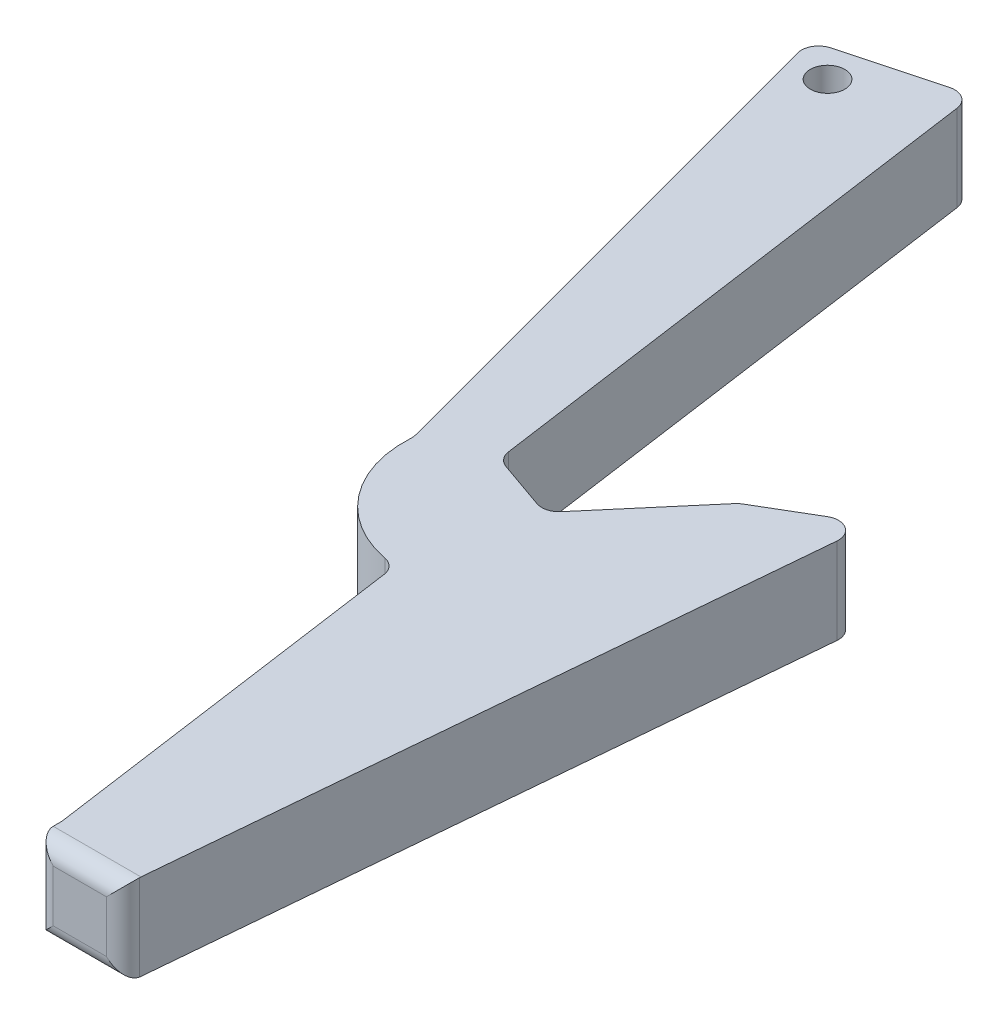
ISO-10303-21;
HEADER;
FILE_DESCRIPTION(('STEP AP214'),'2;1');
FILE_NAME('part.step','',(''),(''),'','','');
FILE_SCHEMA(('AUTOMOTIVE_DESIGN { 1 0 10303 214 1 1 1 1 }'));
ENDSEC;
DATA;
#1=APPLICATION_CONTEXT('core data for automotive mechanical design processes');
#2=APPLICATION_PROTOCOL_DEFINITION('international standard','automotive_design',2000,#1);
#3=PRODUCT_CONTEXT('',#1,'mechanical');
#4=PRODUCT('Part','Part','',(#3));
#5=PRODUCT_RELATED_PRODUCT_CATEGORY('part','',(#4));
#6=PRODUCT_DEFINITION_FORMATION('','',#4);
#7=PRODUCT_DEFINITION_CONTEXT('part definition',#1,'design');
#8=PRODUCT_DEFINITION('design','',#6,#7);
#9=PRODUCT_DEFINITION_SHAPE('','',#8);
#10=(LENGTH_UNIT() NAMED_UNIT(*) SI_UNIT(.MILLI.,.METRE.));
#11=(NAMED_UNIT(*) PLANE_ANGLE_UNIT() SI_UNIT($,.RADIAN.));
#12=(NAMED_UNIT(*) SI_UNIT($,.STERADIAN.) SOLID_ANGLE_UNIT());
#13=UNCERTAINTY_MEASURE_WITH_UNIT(LENGTH_MEASURE(1.E-05),#10,'distance_accuracy_value','');
#14=(GEOMETRIC_REPRESENTATION_CONTEXT(3) GLOBAL_UNCERTAINTY_ASSIGNED_CONTEXT((#13)) GLOBAL_UNIT_ASSIGNED_CONTEXT((#10,
#11,#12)) REPRESENTATION_CONTEXT('',''));
#15=CARTESIAN_POINT('',(0.,0.,0.));
#16=DIRECTION('',(0.,0.,1.));
#17=DIRECTION('',(1.,0.,0.));
#18=AXIS2_PLACEMENT_3D('',#15,#16,#17);
#19=CARTESIAN_POINT('',(-392.834631007093,131.993581300035,-1660.57349387515));
#20=DIRECTION('',(-0.990268068741571,0.,0.139173100960062));
#21=DIRECTION('',(0.139173100960062,0.,0.990268068741571));
#22=AXIS2_PLACEMENT_3D('',#19,#20,#21);
#23=PLANE('',#22);
#24=DIRECTION('',(-0.139173100960062,0.,-0.990268068741571));
#25=VECTOR('',#24,1.);
#26=CARTESIAN_POINT('',(-392.834631007093,131.993581300035,-1660.57349387515));
#27=LINE('',#26,#25);
#28=CARTESIAN_POINT('',(-168.687755361147,131.993581300035,-65.6856015369362));
#29=VERTEX_POINT('',#28);
#30=CARTESIAN_POINT('',(-384.843840888038,131.993581300035,-1603.7160678041));
#31=VERTEX_POINT('',#30);
#32=EDGE_CURVE('E267',#29,#31,#27,.T.);
#33=ORIENTED_EDGE('',*,*,#32,.F.);
#34=DIRECTION('',(0.,-1.,0.));
#35=VECTOR('',#34,1.);
#36=CARTESIAN_POINT('',(-168.687755361147,-121.994217107965,-65.6856015369366));
#37=LINE('',#36,#35);
#38=CARTESIAN_POINT('',(-168.687755361147,-121.994217107965,-65.6856015369362));
#39=VERTEX_POINT('',#38);
#40=EDGE_CURVE('E333',#29,#39,#37,.T.);
#41=ORIENTED_EDGE('',*,*,#40,.T.);
#42=DIRECTION('',(-0.139173100960062,0.,-0.990268068741571));
#43=VECTOR('',#42,1.);
#44=CARTESIAN_POINT('',(-392.834631007093,-121.994217107965,-1660.57349387515));
#45=LINE('',#44,#43);
#46=CARTESIAN_POINT('',(-384.843840888038,-121.994217107965,-1603.7160678041));
#47=VERTEX_POINT('',#46);
#48=EDGE_CURVE('E241',#39,#47,#45,.T.);
#49=ORIENTED_EDGE('',*,*,#48,.T.);
#50=DIRECTION('',(0.,-1.,0.));
#51=VECTOR('',#50,1.);
#52=CARTESIAN_POINT('',(-384.843840888038,131.993581300035,-1603.7160678041));
#53=LINE('',#52,#51);
#54=EDGE_CURVE('E331',#47,#31,#53,.F.);
#55=ORIENTED_EDGE('',*,*,#54,.T.);
#56=EDGE_LOOP('',(#33,#41,#49,#55));
#57=FACE_BOUND('',#56,.T.);
#58=ADVANCED_FACE('F47',(#57),#23,.F.);
#59=CARTESIAN_POINT('',(-392.834631007093,131.993581300035,-1660.57349387515));
#60=DIRECTION('',(0.258819045102515,0.,0.96592582628907));
#61=DIRECTION('',(0.96592582628907,0.,-0.258819045102515));
#62=AXIS2_PLACEMENT_3D('',#59,#60,#61);
#63=PLANE('',#62);
#64=DIRECTION('',(-0.96592582628907,0.,0.258819045102515));
#65=VECTOR('',#64,1.);
#66=CARTESIAN_POINT('',(-392.834631007093,-121.994217107965,-1660.57349387515));
#67=LINE('',#66,#65);
#68=CARTESIAN_POINT('',(-448.294418101051,-121.994217107965,-1645.71308871093));
#69=VERTEX_POINT('',#68);
#70=CARTESIAN_POINT('',(-724.749653810176,-121.994217107965,-1571.63713155931));
#71=VERTEX_POINT('',#70);
#72=EDGE_CURVE('E244',#69,#71,#67,.T.);
#73=ORIENTED_EDGE('',*,*,#72,.T.);
#74=DIRECTION('',(0.,-1.,0.));
#75=VECTOR('',#74,1.);
#76=CARTESIAN_POINT('',(-724.749653810175,131.993581300035,-1571.63713155931));
#77=LINE('',#76,#75);
#78=CARTESIAN_POINT('',(-724.749653810176,131.993581300035,-1571.63713155931));
#79=VERTEX_POINT('',#78);
#80=EDGE_CURVE('E338',#71,#79,#77,.F.);
#81=ORIENTED_EDGE('',*,*,#80,.T.);
#82=DIRECTION('',(-0.96592582628907,0.,0.258819045102515));
#83=VECTOR('',#82,1.);
#84=CARTESIAN_POINT('',(-392.834631007093,131.993581300035,-1660.57349387515));
#85=LINE('',#84,#83);
#86=CARTESIAN_POINT('',(-448.294418101051,131.993581300035,-1645.71308871093));
#87=VERTEX_POINT('',#86);
#88=EDGE_CURVE('E376',#87,#79,#85,.T.);
#89=ORIENTED_EDGE('',*,*,#88,.F.);
#90=DIRECTION('',(0.,-1.,0.));
#91=VECTOR('',#90,1.);
#92=CARTESIAN_POINT('',(-448.294418101051,131.993581300035,-1645.71308871093));
#93=LINE('',#92,#91);
#94=EDGE_CURVE('E336',#87,#69,#93,.T.);
#95=ORIENTED_EDGE('',*,*,#94,.T.);
#96=EDGE_LOOP('',(#73,#81,#89,#95));
#97=FACE_BOUND('',#96,.T.);
#98=ADVANCED_FACE('F446',(#97),#63,.F.);
#99=CARTESIAN_POINT('',(-773.816328619093,131.993581300035,-1558.48975566898));
#100=DIRECTION('',(0.965925826289069,0.,-0.258819045102518));
#101=DIRECTION('',(-0.258819045102518,0.,-0.965925826289069));
#102=AXIS2_PLACEMENT_3D('',#99,#100,#101);
#103=PLANE('',#102);
#104=DIRECTION('',(0.258819045102518,0.,0.965925826289069));
#105=VECTOR('',#104,1.);
#106=CARTESIAN_POINT('',(-773.816328619093,-121.994217107965,-1558.48975566898));
#107=LINE('',#106,#105);
#108=CARTESIAN_POINT('',(-760.668952728763,-121.994217107965,-1509.42308086007));
#109=VERTEX_POINT('',#108);
#110=CARTESIAN_POINT('',(-348.726244773765,-121.994217107965,27.9680350355127));
#111=VERTEX_POINT('',#110);
#112=EDGE_CURVE('E247',#109,#111,#107,.T.);
#113=ORIENTED_EDGE('',*,*,#112,.T.);
#114=DIRECTION('',(0.,1.,0.));
#115=VECTOR('',#114,1.);
#116=CARTESIAN_POINT('',(-348.726244773765,131.993581300035,27.9680350355134));
#117=LINE('',#116,#115);
#118=CARTESIAN_POINT('',(-348.726244773765,131.993581300035,27.9680350355127));
#119=VERTEX_POINT('',#118);
#120=EDGE_CURVE('E312',#111,#119,#117,.T.);
#121=ORIENTED_EDGE('',*,*,#120,.T.);
#122=DIRECTION('',(0.258819045102518,0.,0.965925826289069));
#123=VECTOR('',#122,1.);
#124=CARTESIAN_POINT('',(-773.816328619093,131.993581300035,-1558.48975566898));
#125=LINE('',#124,#123);
#126=CARTESIAN_POINT('',(-760.668952728763,131.993581300035,-1509.42308086007));
#127=VERTEX_POINT('',#126);
#128=EDGE_CURVE('E379',#127,#119,#125,.T.);
#129=ORIENTED_EDGE('',*,*,#128,.F.);
#130=DIRECTION('',(0.,-1.,0.));
#131=VECTOR('',#130,1.);
#132=CARTESIAN_POINT('',(-760.668952728763,131.993581300035,-1509.42308086007));
#133=LINE('',#132,#131);
#134=EDGE_CURVE('E309',#127,#109,#133,.T.);
#135=ORIENTED_EDGE('',*,*,#134,.T.);
#136=EDGE_LOOP('',(#113,#121,#129,#135));
#137=FACE_BOUND('',#136,.T.);
#138=ADVANCED_FACE('F453',(#137),#103,.F.);
#139=CARTESIAN_POINT('',(-17.4560289970844,131.993581300035,63.2717548255097));
#140=DIRECTION('',(0.,-1.,0.));
#141=DIRECTION('',(0.,0.,-1.));
#142=AXIS2_PLACEMENT_3D('',#139,#140,#141);
#143=CYLINDRICAL_SURFACE('',#142,330.1841379304);
#144=CARTESIAN_POINT('',(-17.4560289970844,131.993581300035,63.2717548255097));
#145=DIRECTION('',(0.,1.,0.));
#146=DIRECTION('',(0.,0.,1.));
#147=AXIS2_PLACEMENT_3D('',#144,#145,#146);
#148=CIRCLE('',#147,330.1841379304);
#149=CARTESIAN_POINT('',(-347.081334171269,131.993581300035,44.0695901124656));
#150=VERTEX_POINT('',#149);
#151=CARTESIAN_POINT('',(-79.9099953869851,131.993581300035,387.495546400111));
#152=VERTEX_POINT('',#151);
#153=EDGE_CURVE('E210',#150,#152,#148,.T.);
#154=ORIENTED_EDGE('',*,*,#153,.F.);
#155=DIRECTION('',(0.,-1.,0.));
#156=VECTOR('',#155,1.);
#157=CARTESIAN_POINT('',(-347.081334171269,131.993581300035,44.0695901124656));
#158=LINE('',#157,#156);
#159=CARTESIAN_POINT('',(-347.081334171269,-121.994217107965,44.0695901124656));
#160=VERTEX_POINT('',#159);
#161=EDGE_CURVE('E306',#150,#160,#158,.T.);
#162=ORIENTED_EDGE('',*,*,#161,.T.);
#163=CARTESIAN_POINT('',(-17.4560289970844,-121.994217107965,63.2717548255097));
#164=DIRECTION('',(0.,1.,0.));
#165=DIRECTION('',(0.,0.,1.));
#166=AXIS2_PLACEMENT_3D('',#163,#164,#165);
#167=CIRCLE('',#166,330.1841379304);
#168=CARTESIAN_POINT('',(-79.9099953869851,-121.994217107965,387.495546400111));
#169=VERTEX_POINT('',#168);
#170=EDGE_CURVE('E250',#160,#169,#167,.T.);
#171=ORIENTED_EDGE('',*,*,#170,.T.);
#172=DIRECTION('',(0.,-1.,0.));
#173=VECTOR('',#172,1.);
#174=CARTESIAN_POINT('',(-79.9099953869851,131.993581300035,387.495546400111));
#175=LINE('',#174,#173);
#176=EDGE_CURVE('E304',#169,#152,#175,.F.);
#177=ORIENTED_EDGE('',*,*,#176,.T.);
#178=EDGE_LOOP('',(#154,#162,#171,#177));
#179=FACE_BOUND('',#178,.T.);
#180=ADVANCED_FACE('F457',(#179),#143,.T.);
#181=CARTESIAN_POINT('',(116.079849164418,131.993581300035,1535.2874308478));
#182=DIRECTION('',(0.990268068741571,0.,-0.139173100960063));
#183=DIRECTION('',(-0.139173100960063,0.,-0.990268068741571));
#184=AXIS2_PLACEMENT_3D('',#181,#182,#183);
#185=PLANE('',#184);
#186=DIRECTION('',(0.139173100960063,0.,0.990268068741571));
#187=VECTOR('',#186,1.);
#188=CARTESIAN_POINT('',(116.079849164418,131.993581300035,1535.2874308478));
#189=LINE('',#188,#187);
#190=CARTESIAN_POINT('',(-39.2150965858257,131.993581300035,430.306475817188));
#191=VERTEX_POINT('',#190);
#192=CARTESIAN_POINT('',(116.079849164418,131.993581300035,1535.2874308478));
#193=VERTEX_POINT('',#192);
#194=EDGE_CURVE('E199',#191,#193,#189,.T.);
#195=ORIENTED_EDGE('',*,*,#194,.F.);
#196=DIRECTION('',(0.,1.,0.));
#197=VECTOR('',#196,1.);
#198=CARTESIAN_POINT('',(-39.2150965858257,-121.994217107965,430.306475817188));
#199=LINE('',#198,#197);
#200=CARTESIAN_POINT('',(-39.2150965858257,-121.994217107965,430.306475817188));
#201=VERTEX_POINT('',#200);
#202=EDGE_CURVE('E314',#191,#201,#199,.F.);
#203=ORIENTED_EDGE('',*,*,#202,.T.);
#204=DIRECTION('',(0.139173100960063,0.,0.990268068741571));
#205=VECTOR('',#204,1.);
#206=CARTESIAN_POINT('',(116.079849164418,-121.994217107965,1535.2874308478));
#207=LINE('',#206,#205);
#208=CARTESIAN_POINT('',(116.079849164418,-121.994217107965,1535.2874308478));
#209=VERTEX_POINT('',#208);
#210=EDGE_CURVE('E216',#201,#209,#207,.T.);
#211=ORIENTED_EDGE('',*,*,#210,.T.);
#212=DIRECTION('',(0.,-1.,0.));
#213=VECTOR('',#212,1.);
#214=CARTESIAN_POINT('',(116.079849164418,131.993581300035,1535.2874308478));
#215=LINE('',#214,#213);
#216=EDGE_CURVE('E213',#193,#209,#215,.T.);
#217=ORIENTED_EDGE('',*,*,#216,.F.);
#218=EDGE_LOOP('',(#195,#203,#211,#217));
#219=FACE_BOUND('',#218,.T.);
#220=ADVANCED_FACE('F214',(#219),#185,.F.);
#221=CARTESIAN_POINT('',(116.079849164418,131.993581300035,1611.4837703702));
#222=DIRECTION('',(1.,0.,0.));
#223=DIRECTION('',(0.,0.,-1.));
#224=AXIS2_PLACEMENT_3D('',#221,#222,#223);
#225=PLANE('',#224);
#226=DIRECTION('',(0.,0.,1.));
#227=VECTOR('',#226,1.);
#228=CARTESIAN_POINT('',(116.079849164418,-121.994217107965,1611.4837703702));
#229=LINE('',#228,#227);
#230=CARTESIAN_POINT('',(116.079849164418,-121.994217107965,1560.6862106886));
#231=VERTEX_POINT('',#230);
#232=EDGE_CURVE('E254',#209,#231,#229,.T.);
#233=ORIENTED_EDGE('',*,*,#232,.T.);
#234=DIRECTION('',(0.,-1.,0.));
#235=VECTOR('',#234,1.);
#236=CARTESIAN_POINT('',(116.079849164418,131.993581300035,1560.6862106886));
#237=LINE('',#236,#235);
#238=CARTESIAN_POINT('',(116.079849164418,131.993581300035,1560.6862106886));
#239=VERTEX_POINT('',#238);
#240=EDGE_CURVE('E226',#231,#239,#237,.F.);
#241=ORIENTED_EDGE('',*,*,#240,.T.);
#242=DIRECTION('',(0.,0.,1.));
#243=VECTOR('',#242,1.);
#244=CARTESIAN_POINT('',(116.079849164418,131.993581300035,1611.4837703702));
#245=LINE('',#244,#243);
#246=EDGE_CURVE('E203',#193,#239,#245,.T.);
#247=ORIENTED_EDGE('',*,*,#246,.F.);
#248=ORIENTED_EDGE('',*,*,#216,.T.);
#249=EDGE_LOOP('',(#233,#241,#247,#248));
#250=FACE_BOUND('',#249,.T.);
#251=ADVANCED_FACE('F224',(#250),#225,.F.);
#252=CARTESIAN_POINT('',(370.067647572418,131.993581300035,1611.4837703702));
#253=DIRECTION('',(0.,0.,-1.));
#254=DIRECTION('',(-1.,0.,0.));
#255=AXIS2_PLACEMENT_3D('',#252,#253,#254);
#256=PLANE('',#255);
#257=DIRECTION('',(1.,0.,0.));
#258=VECTOR('',#257,1.);
#259=CARTESIAN_POINT('',(116.079849164418,81.1960216184347,1611.4837703702));
#260=LINE('',#259,#258);
#261=CARTESIAN_POINT('',(323.606120491679,81.1960216184347,1611.4837703702));
#262=VERTEX_POINT('',#261);
#263=CARTESIAN_POINT('',(166.877408846018,81.1960216184347,1611.4837703702));
#264=VERTEX_POINT('',#263);
#265=EDGE_CURVE('E272',#262,#264,#260,.F.);
#266=ORIENTED_EDGE('',*,*,#265,.T.);
#267=DIRECTION('',(0.,-1.,0.));
#268=VECTOR('',#267,1.);
#269=CARTESIAN_POINT('',(166.877408846018,131.993581300035,1611.4837703702));
#270=LINE('',#269,#268);
#271=CARTESIAN_POINT('',(166.877408846018,-71.1966574263653,1611.4837703702));
#272=VERTEX_POINT('',#271);
#273=EDGE_CURVE('E274',#264,#272,#270,.T.);
#274=ORIENTED_EDGE('',*,*,#273,.T.);
#275=DIRECTION('',(1.,0.,0.));
#276=VECTOR('',#275,1.);
#277=CARTESIAN_POINT('',(370.067647572418,-71.1966574263653,1611.4837703702));
#278=LINE('',#277,#276);
#279=CARTESIAN_POINT('',(323.606120491679,-71.1966574263653,1611.4837703702));
#280=VERTEX_POINT('',#279);
#281=EDGE_CURVE('E220',#272,#280,#278,.T.);
#282=ORIENTED_EDGE('',*,*,#281,.T.);
#283=DIRECTION('',(0.,-1.,0.));
#284=VECTOR('',#283,1.);
#285=CARTESIAN_POINT('',(323.606120491679,131.993581300035,1611.4837703702));
#286=LINE('',#285,#284);
#287=EDGE_CURVE('E270',#280,#262,#286,.F.);
#288=ORIENTED_EDGE('',*,*,#287,.T.);
#289=EDGE_LOOP('',(#266,#274,#282,#288));
#290=FACE_BOUND('',#289,.T.);
#291=ADVANCED_FACE('F401',(#290),#256,.F.);
#292=CARTESIAN_POINT('',(551.60217621528,131.993581300035,-420.418616893803));
#293=DIRECTION('',(-0.996032724501308,0.,-0.0889877054569934));
#294=DIRECTION('',(-0.0889877054569934,0.,0.996032724501308));
#295=AXIS2_PLACEMENT_3D('',#292,#293,#294);
#296=PLANE('',#295);
#297=DIRECTION('',(0.0889877054569934,0.,-0.996032724501308));
#298=VECTOR('',#297,1.);
#299=CARTESIAN_POINT('',(551.60217621528,131.993581300035,-420.418616893803));
#300=LINE('',#299,#298);
#301=CARTESIAN_POINT('',(374.60601078849,131.993581300035,1560.6862106886));
#302=VERTEX_POINT('',#301);
#303=CARTESIAN_POINT('',(542.803771441458,131.993581300035,-321.938731013718));
#304=VERTEX_POINT('',#303);
#305=EDGE_CURVE('E227',#302,#304,#300,.T.);
#306=ORIENTED_EDGE('',*,*,#305,.F.);
#307=CARTESIAN_POINT('',(374.60601078849,81.1960216184347,1560.6862106886));
#308=DIRECTION('',(-0.996032724501308,0.,-0.0889877054569934));
#309=DIRECTION('',(-0.0889877054569934,0.,0.996032724501308));
#310=AXIS2_PLACEMENT_3D('',#307,#308,#309);
#311=ELLIPSE('',#310,50.9998902968105,50.7975596816);
#312=CARTESIAN_POINT('',(374.202152259361,131.792053386117,1565.20656896748));
#313=VERTEX_POINT('',#312);
#314=EDGE_CURVE('E294',#302,#313,#311,.F.);
#315=ORIENTED_EDGE('',*,*,#314,.T.);
#316=DIRECTION('',(0.,-1.,0.));
#317=VECTOR('',#316,1.);
#318=CARTESIAN_POINT('',(374.202152259361,131.993581300035,1565.20656896748));
#319=LINE('',#318,#317);
#320=CARTESIAN_POINT('',(374.202152259361,-121.792689194047,1565.20656896748));
#321=VERTEX_POINT('',#320);
#322=EDGE_CURVE('E292',#313,#321,#319,.T.);
#323=ORIENTED_EDGE('',*,*,#322,.T.);
#324=CARTESIAN_POINT('',(374.60601078849,-71.1966574263653,1560.6862106886));
#325=DIRECTION('',(-0.996032724501308,0.,-0.0889877054569934));
#326=DIRECTION('',(0.0889877054569934,0.,-0.996032724501308));
#327=AXIS2_PLACEMENT_3D('',#324,#325,#326);
#328=ELLIPSE('',#327,50.9998902968105,50.7975596816);
#329=CARTESIAN_POINT('',(374.60601078849,-121.994217107965,1560.6862106886));
#330=VERTEX_POINT('',#329);
#331=EDGE_CURVE('E290',#321,#330,#328,.F.);
#332=ORIENTED_EDGE('',*,*,#331,.T.);
#333=DIRECTION('',(0.0889877054569934,0.,-0.996032724501308));
#334=VECTOR('',#333,1.);
#335=CARTESIAN_POINT('',(551.60217621528,-121.994217107965,-420.418616893803));
#336=LINE('',#335,#334);
#337=CARTESIAN_POINT('',(542.803771441458,-121.994217107965,-321.938731013718));
#338=VERTEX_POINT('',#337);
#339=EDGE_CURVE('E256',#330,#338,#336,.T.);
#340=ORIENTED_EDGE('',*,*,#339,.T.);
#341=DIRECTION('',(0.,-1.,0.));
#342=VECTOR('',#341,1.);
#343=CARTESIAN_POINT('',(542.803771441458,131.993581300035,-321.938731013718));
#344=LINE('',#343,#342);
#345=EDGE_CURVE('E288',#338,#304,#344,.F.);
#346=ORIENTED_EDGE('',*,*,#345,.T.);
#347=EDGE_LOOP('',(#306,#315,#323,#332,#340,#346));
#348=FACE_BOUND('',#347,.T.);
#349=ADVANCED_FACE('F406',(#348),#296,.F.);
#350=CARTESIAN_POINT('',(302.084426621297,131.993581300035,-273.387870161801));
#351=DIRECTION('',(0.507675652585662,0.,0.861548275937989));
#352=DIRECTION('',(0.861548275937989,0.,-0.507675652585662));
#353=AXIS2_PLACEMENT_3D('',#350,#351,#352);
#354=PLANE('',#353);
#355=DIRECTION('',(-0.861548275937989,0.,0.507675652585662));
#356=VECTOR('',#355,1.);
#357=CARTESIAN_POINT('',(302.084426621297,131.993581300035,-273.387870161801));
#358=LINE('',#357,#356);
#359=CARTESIAN_POINT('',(466.419055412661,131.993581300035,-370.223639258138));
#360=VERTEX_POINT('',#359);
#361=CARTESIAN_POINT('',(309.451536343491,131.993581300035,-277.729010803993));
#362=VERTEX_POINT('',#361);
#363=EDGE_CURVE('E230',#360,#362,#358,.T.);
#364=ORIENTED_EDGE('',*,*,#363,.F.);
#365=DIRECTION('',(0.,-1.,0.));
#366=VECTOR('',#365,1.);
#367=CARTESIAN_POINT('',(466.419055412661,131.993581300035,-370.223639258138));
#368=LINE('',#367,#366);
#369=CARTESIAN_POINT('',(466.419055412661,-121.994217107965,-370.223639258138));
#370=VERTEX_POINT('',#369);
#371=EDGE_CURVE('E318',#360,#370,#368,.T.);
#372=ORIENTED_EDGE('',*,*,#371,.T.);
#373=DIRECTION('',(-0.861548275937989,0.,0.507675652585662));
#374=VECTOR('',#373,1.);
#375=CARTESIAN_POINT('',(302.084426621297,-121.994217107965,-273.387870161801));
#376=LINE('',#375,#374);
#377=CARTESIAN_POINT('',(309.451536343491,-121.994217107965,-277.729010803993));
#378=VERTEX_POINT('',#377);
#379=EDGE_CURVE('E259',#370,#378,#376,.T.);
#380=ORIENTED_EDGE('',*,*,#379,.T.);
#381=DIRECTION('',(0.,-1.,0.));
#382=VECTOR('',#381,1.);
#383=CARTESIAN_POINT('',(309.451536343491,131.993581300035,-277.729010803993));
#384=LINE('',#383,#382);
#385=EDGE_CURVE('E316',#378,#362,#384,.F.);
#386=ORIENTED_EDGE('',*,*,#385,.T.);
#387=EDGE_LOOP('',(#364,#372,#380,#386));
#388=FACE_BOUND('',#387,.T.);
#389=ADVANCED_FACE('F415',(#388),#354,.F.);
#390=CARTESIAN_POINT('',(38.8078137511931,131.993581300035,36.1771756208437));
#391=DIRECTION('',(0.761761607553109,0.,0.647857432818443));
#392=DIRECTION('',(0.647857432818443,0.,-0.761761607553109));
#393=AXIS2_PLACEMENT_3D('',#390,#391,#392);
#394=PLANE('',#393);
#395=DIRECTION('',(-0.647857432818443,0.,0.761761607553109));
#396=VECTOR('',#395,1.);
#397=CARTESIAN_POINT('',(38.8078137511931,131.993581300035,36.1771756208437));
#398=LINE('',#397,#396);
#399=CARTESIAN_POINT('',(296.544589881776,131.993581300035,-266.874037447217));
#400=VERTEX_POINT('',#399);
#401=CARTESIAN_POINT('',(61.3997177416087,131.993581300035,9.61323696761944));
#402=VERTEX_POINT('',#401);
#403=EDGE_CURVE('E236',#400,#402,#398,.T.);
#404=ORIENTED_EDGE('',*,*,#403,.F.);
#405=DIRECTION('',(0.,-1.,0.));
#406=VECTOR('',#405,1.);
#407=CARTESIAN_POINT('',(296.544589881776,131.993581300035,-266.874037447216));
#408=LINE('',#407,#406);
#409=CARTESIAN_POINT('',(296.544589881776,-121.994217107965,-266.874037447217));
#410=VERTEX_POINT('',#409);
#411=EDGE_CURVE('E323',#400,#410,#408,.T.);
#412=ORIENTED_EDGE('',*,*,#411,.T.);
#413=DIRECTION('',(-0.647857432818443,0.,0.761761607553109));
#414=VECTOR('',#413,1.);
#415=CARTESIAN_POINT('',(38.8078137511931,-121.994217107965,36.1771756208437));
#416=LINE('',#415,#414);
#417=CARTESIAN_POINT('',(61.3997177416087,-121.994217107965,9.61323696761944));
#418=VERTEX_POINT('',#417);
#419=EDGE_CURVE('E262',#410,#418,#416,.T.);
#420=ORIENTED_EDGE('',*,*,#419,.T.);
#421=DIRECTION('',(0.,-1.,0.));
#422=VECTOR('',#421,1.);
#423=CARTESIAN_POINT('',(61.3997177416087,131.993581300035,9.61323696761944));
#424=LINE('',#423,#422);
#425=EDGE_CURVE('E321',#418,#402,#424,.F.);
#426=ORIENTED_EDGE('',*,*,#425,.T.);
#427=EDGE_LOOP('',(#404,#412,#420,#426));
#428=FACE_BOUND('',#427,.T.);
#429=ADVANCED_FACE('F424',(#428),#394,.F.);
#430=CARTESIAN_POINT('',(-164.382424975207,131.993581300035,-35.0515840639549));
#431=DIRECTION('',(-0.330814518681776,0.,0.943695795386069));
#432=DIRECTION('',(0.943695795386069,0.,0.330814518681776));
#433=AXIS2_PLACEMENT_3D('',#430,#431,#432);
#434=PLANE('',#433);
#435=DIRECTION('',(-0.943695795386069,0.,-0.330814518681776));
#436=VECTOR('',#435,1.);
#437=CARTESIAN_POINT('',(-164.382424975207,131.993581300035,-35.0515840639549));
#438=LINE('',#437,#436);
#439=CARTESIAN_POINT('',(5.89951676250088,131.993581300035,24.641103846255));
#440=VERTEX_POINT('',#439);
#441=CARTESIAN_POINT('',(-135.189124294742,131.993581300035,-24.8178119516298));
#442=VERTEX_POINT('',#441);
#443=EDGE_CURVE('E221',#440,#442,#438,.T.);
#444=ORIENTED_EDGE('',*,*,#443,.F.);
#445=DIRECTION('',(0.,-1.,0.));
#446=VECTOR('',#445,1.);
#447=CARTESIAN_POINT('',(5.89951676250088,-121.994217107965,24.641103846255));
#448=LINE('',#447,#446);
#449=CARTESIAN_POINT('',(5.89951676250088,-121.994217107965,24.641103846255));
#450=VERTEX_POINT('',#449);
#451=EDGE_CURVE('E328',#440,#450,#448,.T.);
#452=ORIENTED_EDGE('',*,*,#451,.T.);
#453=DIRECTION('',(-0.943695795386069,0.,-0.330814518681776));
#454=VECTOR('',#453,1.);
#455=CARTESIAN_POINT('',(-164.382424975207,-121.994217107965,-35.0515840639549));
#456=LINE('',#455,#454);
#457=CARTESIAN_POINT('',(-135.189124294742,-121.994217107965,-24.8178119516298));
#458=VERTEX_POINT('',#457);
#459=EDGE_CURVE('E265',#450,#458,#456,.T.);
#460=ORIENTED_EDGE('',*,*,#459,.T.);
#461=DIRECTION('',(0.,-1.,0.));
#462=VECTOR('',#461,1.);
#463=CARTESIAN_POINT('',(-135.189124294742,131.993581300035,-24.8178119516298));
#464=LINE('',#463,#462);
#465=EDGE_CURVE('E326',#458,#442,#464,.F.);
#466=ORIENTED_EDGE('',*,*,#465,.T.);
#467=EDGE_LOOP('',(#444,#452,#460,#466));
#468=FACE_BOUND('',#467,.T.);
#469=ADVANCED_FACE('F433',(#468),#434,.F.);
#470=CARTESIAN_POINT('',(-17.4560289970844,131.993581300035,63.2717548255097));
#471=DIRECTION('',(0.,1.,0.));
#472=DIRECTION('',(0.,0.,1.));
#473=AXIS2_PLACEMENT_3D('',#470,#471,#472);
#474=PLANE('',#473);
#475=CARTESIAN_POINT('',(-649.388227220598,131.993581300035,-1486.65115783181));
#476=DIRECTION('',(0.,1.,0.));
#477=DIRECTION('',(0.,0.,1.));
#478=AXIS2_PLACEMENT_3D('',#475,#476,#477);
#479=CIRCLE('',#478,50.7975596816001);
#480=CARTESIAN_POINT('',(-649.388227220598,131.993581300035,-1435.85359815021));
#481=VERTEX_POINT('',#480);
#482=EDGE_CURVE('E362',#481,#481,#479,.T.);
#483=ORIENTED_EDGE('',*,*,#482,.F.);
#484=EDGE_LOOP('',(#483));
#485=FACE_BOUND('',#484,.T.);
#486=ORIENTED_EDGE('',*,*,#246,.T.);
#487=DIRECTION('',(1.,0.,0.));
#488=VECTOR('',#487,1.);
#489=CARTESIAN_POINT('',(370.067647572418,131.993581300035,1560.6862106886));
#490=LINE('',#489,#488);
#491=EDGE_CURVE('E286',#239,#302,#490,.T.);
#492=ORIENTED_EDGE('',*,*,#491,.T.);
#493=ORIENTED_EDGE('',*,*,#305,.T.);
#494=CARTESIAN_POINT('',(492.207739673776,131.993581300035,-326.459089292598));
#495=DIRECTION('',(0.,1.,0.));
#496=DIRECTION('',(0.,0.,1.));
#497=AXIS2_PLACEMENT_3D('',#494,#495,#496);
#498=CIRCLE('',#497,50.7975596816);
#499=EDGE_CURVE('E284',#304,#360,#498,.T.);
#500=ORIENTED_EDGE('',*,*,#499,.T.);
#501=ORIENTED_EDGE('',*,*,#363,.T.);
#502=CARTESIAN_POINT('',(335.240220604606,131.993581300035,-233.964460838453));
#503=DIRECTION('',(0.,1.,0.));
#504=DIRECTION('',(0.,0.,1.));
#505=AXIS2_PLACEMENT_3D('',#502,#503,#504);
#506=CIRCLE('',#505,50.7975596816);
#507=EDGE_CURVE('E282',#362,#400,#506,.T.);
#508=ORIENTED_EDGE('',*,*,#507,.T.);
#509=ORIENTED_EDGE('',*,*,#403,.T.);
#510=CARTESIAN_POINT('',(22.7040870187781,131.993581300035,-23.2963396411436));
#511=DIRECTION('',(0.,1.,0.));
#512=DIRECTION('',(0.,0.,1.));
#513=AXIS2_PLACEMENT_3D('',#510,#511,#512);
#514=CIRCLE('',#513,50.7975596816);
#515=EDGE_CURVE('E349',#402,#440,#514,.F.);
#516=ORIENTED_EDGE('',*,*,#515,.T.);
#517=ORIENTED_EDGE('',*,*,#443,.T.);
#518=CARTESIAN_POINT('',(-118.384554038465,131.993581300035,-72.7552554390287));
#519=DIRECTION('',(0.,1.,0.));
#520=DIRECTION('',(0.,0.,1.));
#521=AXIS2_PLACEMENT_3D('',#518,#519,#520);
#522=CIRCLE('',#521,50.7975596816);
#523=EDGE_CURVE('E11',#442,#29,#522,.F.);
#524=ORIENTED_EDGE('',*,*,#523,.T.);
#525=ORIENTED_EDGE('',*,*,#32,.T.);
#526=CARTESIAN_POINT('',(-435.147042210721,131.993581300035,-1596.64641390201));
#527=DIRECTION('',(0.,1.,0.));
#528=DIRECTION('',(0.,0.,1.));
#529=AXIS2_PLACEMENT_3D('',#526,#527,#528);
#530=CIRCLE('',#529,50.7975596816);
#531=EDGE_CURVE('E278',#31,#87,#530,.T.);
#532=ORIENTED_EDGE('',*,*,#531,.T.);
#533=ORIENTED_EDGE('',*,*,#88,.T.);
#534=CARTESIAN_POINT('',(-711.602277919846,131.993581300035,-1522.5704567504));
#535=DIRECTION('',(0.,1.,0.));
#536=DIRECTION('',(0.,0.,1.));
#537=AXIS2_PLACEMENT_3D('',#534,#535,#536);
#538=CIRCLE('',#537,50.7975596816);
#539=EDGE_CURVE('E280',#79,#127,#538,.T.);
#540=ORIENTED_EDGE('',*,*,#539,.T.);
#541=ORIENTED_EDGE('',*,*,#128,.T.);
#542=CARTESIAN_POINT('',(-397.792919582682,131.993581300035,41.1154109258434));
#543=DIRECTION('',(0.,1.,0.));
#544=DIRECTION('',(0.,0.,1.));
#545=AXIS2_PLACEMENT_3D('',#542,#543,#544);
#546=CIRCLE('',#545,50.7975596816);
#547=EDGE_CURVE('E342',#119,#150,#546,.F.);
#548=ORIENTED_EDGE('',*,*,#547,.T.);
#549=ORIENTED_EDGE('',*,*,#153,.T.);
#550=CARTESIAN_POINT('',(-89.5182979085084,131.993581300035,437.376129719281));
#551=DIRECTION('',(0.,1.,0.));
#552=DIRECTION('',(0.,0.,1.));
#553=AXIS2_PLACEMENT_3D('',#550,#551,#552);
#554=CIRCLE('',#553,50.7975596816);
#555=EDGE_CURVE('E206',#152,#191,#554,.F.);
#556=ORIENTED_EDGE('',*,*,#555,.T.);
#557=ORIENTED_EDGE('',*,*,#194,.T.);
#558=EDGE_LOOP('',(#486,#492,#493,#500,#501,#508,#509,#516,#517,#524,#525,#532,#533,#540,#541,
#548,#549,#556,#557));
#559=FACE_BOUND('',#558,.T.);
#560=ADVANCED_FACE('F201',(#485,#559),#474,.T.);
#561=CARTESIAN_POINT('',(-17.4560289970844,-121.994217107965,63.2717548255097));
#562=DIRECTION('',(0.,1.,0.));
#563=DIRECTION('',(0.,0.,1.));
#564=AXIS2_PLACEMENT_3D('',#561,#562,#563);
#565=PLANE('',#564);
#566=CARTESIAN_POINT('',(-649.388227220598,-121.994217107965,-1486.65115783181));
#567=DIRECTION('',(0.,1.,0.));
#568=DIRECTION('',(0.,0.,1.));
#569=AXIS2_PLACEMENT_3D('',#566,#567,#568);
#570=CIRCLE('',#569,50.7975596816001);
#571=CARTESIAN_POINT('',(-649.388227220598,-121.994217107965,-1435.85359815021));
#572=VERTEX_POINT('',#571);
#573=EDGE_CURVE('E245',#572,#572,#570,.T.);
#574=ORIENTED_EDGE('',*,*,#573,.T.);
#575=EDGE_LOOP('',(#574));
#576=FACE_BOUND('',#575,.T.);
#577=ORIENTED_EDGE('',*,*,#339,.F.);
#578=DIRECTION('',(1.,0.,0.));
#579=VECTOR('',#578,1.);
#580=CARTESIAN_POINT('',(-17.4560289970844,-121.994217107965,1560.6862106886));
#581=LINE('',#580,#579);
#582=EDGE_CURVE('E302',#330,#231,#581,.F.);
#583=ORIENTED_EDGE('',*,*,#582,.T.);
#584=ORIENTED_EDGE('',*,*,#232,.F.);
#585=ORIENTED_EDGE('',*,*,#210,.F.);
#586=CARTESIAN_POINT('',(-89.5182979085084,-121.994217107965,437.376129719281));
#587=DIRECTION('',(0.,1.,0.));
#588=DIRECTION('',(0.,0.,1.));
#589=AXIS2_PLACEMENT_3D('',#586,#587,#588);
#590=CIRCLE('',#589,50.7975596816);
#591=EDGE_CURVE('E344',#201,#169,#590,.T.);
#592=ORIENTED_EDGE('',*,*,#591,.T.);
#593=ORIENTED_EDGE('',*,*,#170,.F.);
#594=CARTESIAN_POINT('',(-397.792919582682,-121.994217107965,41.1154109258434));
#595=DIRECTION('',(0.,1.,0.));
#596=DIRECTION('',(0.,0.,1.));
#597=AXIS2_PLACEMENT_3D('',#594,#595,#596);
#598=CIRCLE('',#597,50.7975596816);
#599=EDGE_CURVE('E340',#160,#111,#598,.T.);
#600=ORIENTED_EDGE('',*,*,#599,.T.);
#601=ORIENTED_EDGE('',*,*,#112,.F.);
#602=CARTESIAN_POINT('',(-711.602277919846,-121.994217107965,-1522.5704567504));
#603=DIRECTION('',(0.,1.,0.));
#604=DIRECTION('',(0.,0.,1.));
#605=AXIS2_PLACEMENT_3D('',#602,#603,#604);
#606=CIRCLE('',#605,50.7975596816);
#607=EDGE_CURVE('E64',#109,#71,#606,.F.);
#608=ORIENTED_EDGE('',*,*,#607,.T.);
#609=ORIENTED_EDGE('',*,*,#72,.F.);
#610=CARTESIAN_POINT('',(-435.147042210721,-121.994217107965,-1596.64641390201));
#611=DIRECTION('',(0.,1.,0.));
#612=DIRECTION('',(0.,0.,1.));
#613=AXIS2_PLACEMENT_3D('',#610,#611,#612);
#614=CIRCLE('',#613,50.7975596816);
#615=EDGE_CURVE('E72',#69,#47,#614,.F.);
#616=ORIENTED_EDGE('',*,*,#615,.T.);
#617=ORIENTED_EDGE('',*,*,#48,.F.);
#618=CARTESIAN_POINT('',(-118.384554038465,-121.994217107965,-72.7552554390287));
#619=DIRECTION('',(0.,1.,0.));
#620=DIRECTION('',(0.,0.,1.));
#621=AXIS2_PLACEMENT_3D('',#618,#619,#620);
#622=CIRCLE('',#621,50.7975596816);
#623=EDGE_CURVE('E56',#39,#458,#622,.T.);
#624=ORIENTED_EDGE('',*,*,#623,.T.);
#625=ORIENTED_EDGE('',*,*,#459,.F.);
#626=CARTESIAN_POINT('',(22.7040870187781,-121.994217107965,-23.2963396411436));
#627=DIRECTION('',(0.,1.,0.));
#628=DIRECTION('',(0.,0.,1.));
#629=AXIS2_PLACEMENT_3D('',#626,#627,#628);
#630=CIRCLE('',#629,50.7975596816);
#631=EDGE_CURVE('E347',#450,#418,#630,.T.);
#632=ORIENTED_EDGE('',*,*,#631,.T.);
#633=ORIENTED_EDGE('',*,*,#419,.F.);
#634=CARTESIAN_POINT('',(335.240220604606,-121.994217107965,-233.964460838453));
#635=DIRECTION('',(0.,1.,0.));
#636=DIRECTION('',(0.,0.,1.));
#637=AXIS2_PLACEMENT_3D('',#634,#635,#636);
#638=CIRCLE('',#637,50.7975596816);
#639=EDGE_CURVE('E298',#410,#378,#638,.F.);
#640=ORIENTED_EDGE('',*,*,#639,.T.);
#641=ORIENTED_EDGE('',*,*,#379,.F.);
#642=CARTESIAN_POINT('',(492.207739673776,-121.994217107965,-326.459089292598));
#643=DIRECTION('',(0.,1.,0.));
#644=DIRECTION('',(0.,0.,1.));
#645=AXIS2_PLACEMENT_3D('',#642,#643,#644);
#646=CIRCLE('',#645,50.7975596816);
#647=EDGE_CURVE('E300',#370,#338,#646,.F.);
#648=ORIENTED_EDGE('',*,*,#647,.T.);
#649=EDGE_LOOP('',(#577,#583,#584,#585,#592,#593,#600,#601,#608,#609,#616,#617,#624,#625,#632,
#633,#640,#641,#648));
#650=FACE_BOUND('',#649,.T.);
#651=ADVANCED_FACE('F389',(#576,#650),#565,.F.);
#652=CARTESIAN_POINT('',(-649.388227220598,-121.994217107965,-1486.65115783181));
#653=DIRECTION('',(0.,1.,0.));
#654=DIRECTION('',(0.,0.,1.));
#655=AXIS2_PLACEMENT_3D('',#652,#653,#654);
#656=CYLINDRICAL_SURFACE('',#655,50.7975596816001);
#657=ORIENTED_EDGE('',*,*,#573,.F.);
#658=EDGE_LOOP('',(#657));
#659=FACE_BOUND('',#658,.T.);
#660=ORIENTED_EDGE('',*,*,#482,.T.);
#661=EDGE_LOOP('',(#660));
#662=FACE_BOUND('',#661,.T.);
#663=ADVANCED_FACE('F482',(#659,#662),#656,.F.);
#664=CARTESIAN_POINT('',(323.606120491679,131.993581300035,1560.6862106886));
#665=DIRECTION('',(0.,-1.,0.));
#666=DIRECTION('',(0.,0.,-1.));
#667=AXIS2_PLACEMENT_3D('',#664,#665,#666);
#668=CYLINDRICAL_SURFACE('',#667,50.7975596816);
#669=CARTESIAN_POINT('',(323.606120491679,-71.1966574263653,1560.6862106886));
#670=DIRECTION('',(0.707106781186547,0.707106781186547,0.));
#671=DIRECTION('',(0.707106781186547,-0.707106781186547,0.));
#672=AXIS2_PLACEMENT_3D('',#669,#670,#671);
#673=ELLIPSE('',#672,71.8385978371754,50.7975596816);
#674=EDGE_CURVE('E355',#321,#280,#673,.F.);
#675=ORIENTED_EDGE('',*,*,#674,.F.);
#676=ORIENTED_EDGE('',*,*,#322,.F.);
#677=CARTESIAN_POINT('',(323.606120491679,81.1960216184347,1560.6862106886));
#678=DIRECTION('',(0.707106781186547,-0.707106781186547,0.));
#679=DIRECTION('',(-0.707106781186547,-0.707106781186547,0.));
#680=AXIS2_PLACEMENT_3D('',#677,#678,#679);
#681=ELLIPSE('',#680,71.8385978371754,50.7975596816);
#682=EDGE_CURVE('E51',#262,#313,#681,.F.);
#683=ORIENTED_EDGE('',*,*,#682,.F.);
#684=ORIENTED_EDGE('',*,*,#287,.F.);
#685=EDGE_LOOP('',(#675,#676,#683,#684));
#686=FACE_BOUND('',#685,.T.);
#687=ADVANCED_FACE('F479',(#686),#668,.T.);
#688=CARTESIAN_POINT('',(-17.4560289970844,81.1960216184347,1560.6862106886));
#689=DIRECTION('',(-1.,0.,0.));
#690=DIRECTION('',(0.,0.,1.));
#691=AXIS2_PLACEMENT_3D('',#688,#689,#690);
#692=CYLINDRICAL_SURFACE('',#691,50.7975596816);
#693=ORIENTED_EDGE('',*,*,#314,.F.);
#694=ORIENTED_EDGE('',*,*,#491,.F.);
#695=CARTESIAN_POINT('',(166.877408846018,81.1960216184347,1560.6862106886));
#696=DIRECTION('',(-0.707106781186547,-0.707106781186547,0.));
#697=DIRECTION('',(-0.707106781186547,0.707106781186547,0.));
#698=AXIS2_PLACEMENT_3D('',#695,#696,#697);
#699=ELLIPSE('',#698,71.8385978371754,50.7975596816);
#700=EDGE_CURVE('E354',#264,#239,#699,.T.);
#701=ORIENTED_EDGE('',*,*,#700,.F.);
#702=ORIENTED_EDGE('',*,*,#265,.F.);
#703=ORIENTED_EDGE('',*,*,#682,.T.);
#704=EDGE_LOOP('',(#693,#694,#701,#702,#703));
#705=FACE_BOUND('',#704,.T.);
#706=ADVANCED_FACE('F402',(#705),#692,.T.);
#707=CARTESIAN_POINT('',(370.067647572418,-71.1966574263653,1560.6862106886));
#708=DIRECTION('',(1.,0.,0.));
#709=DIRECTION('',(0.,0.,-1.));
#710=AXIS2_PLACEMENT_3D('',#707,#708,#709);
#711=CYLINDRICAL_SURFACE('',#710,50.7975596816);
#712=ORIENTED_EDGE('',*,*,#674,.T.);
#713=ORIENTED_EDGE('',*,*,#281,.F.);
#714=CARTESIAN_POINT('',(166.877408846018,-71.1966574263653,1560.6862106886));
#715=DIRECTION('',(0.707106781186547,-0.707106781186547,0.));
#716=DIRECTION('',(0.707106781186547,0.707106781186547,0.));
#717=AXIS2_PLACEMENT_3D('',#714,#715,#716);
#718=ELLIPSE('',#717,71.8385978371754,50.7975596816);
#719=EDGE_CURVE('E352',#231,#272,#718,.F.);
#720=ORIENTED_EDGE('',*,*,#719,.F.);
#721=ORIENTED_EDGE('',*,*,#582,.F.);
#722=ORIENTED_EDGE('',*,*,#331,.F.);
#723=EDGE_LOOP('',(#712,#713,#720,#721,#722));
#724=FACE_BOUND('',#723,.T.);
#725=ADVANCED_FACE('F398',(#724),#711,.T.);
#726=CARTESIAN_POINT('',(166.877408846018,131.993581300035,1560.6862106886));
#727=DIRECTION('',(0.,-1.,0.));
#728=DIRECTION('',(0.,0.,-1.));
#729=AXIS2_PLACEMENT_3D('',#726,#727,#728);
#730=CYLINDRICAL_SURFACE('',#729,50.7975596816);
#731=ORIENTED_EDGE('',*,*,#700,.T.);
#732=ORIENTED_EDGE('',*,*,#240,.F.);
#733=ORIENTED_EDGE('',*,*,#719,.T.);
#734=ORIENTED_EDGE('',*,*,#273,.F.);
#735=EDGE_LOOP('',(#731,#732,#733,#734));
#736=FACE_BOUND('',#735,.T.);
#737=ADVANCED_FACE('F394',(#736),#730,.T.);
#738=CARTESIAN_POINT('',(-397.792919582682,131.993581300035,41.1154109258434));
#739=DIRECTION('',(0.,-1.,0.));
#740=DIRECTION('',(0.,0.,-1.));
#741=AXIS2_PLACEMENT_3D('',#738,#739,#740);
#742=CYLINDRICAL_SURFACE('',#741,50.7975596816);
#743=ORIENTED_EDGE('',*,*,#547,.F.);
#744=ORIENTED_EDGE('',*,*,#120,.F.);
#745=ORIENTED_EDGE('',*,*,#599,.F.);
#746=ORIENTED_EDGE('',*,*,#161,.F.);
#747=EDGE_LOOP('',(#743,#744,#745,#746));
#748=FACE_BOUND('',#747,.T.);
#749=ADVANCED_FACE('F456',(#748),#742,.F.);
#750=CARTESIAN_POINT('',(-89.5182979085084,131.993581300035,437.376129719281));
#751=DIRECTION('',(0.,-1.,0.));
#752=DIRECTION('',(0.,0.,-1.));
#753=AXIS2_PLACEMENT_3D('',#750,#751,#752);
#754=CYLINDRICAL_SURFACE('',#753,50.7975596816);
#755=ORIENTED_EDGE('',*,*,#555,.F.);
#756=ORIENTED_EDGE('',*,*,#176,.F.);
#757=ORIENTED_EDGE('',*,*,#591,.F.);
#758=ORIENTED_EDGE('',*,*,#202,.F.);
#759=EDGE_LOOP('',(#755,#756,#757,#758));
#760=FACE_BOUND('',#759,.T.);
#761=ADVANCED_FACE('F387',(#760),#754,.F.);
#762=CARTESIAN_POINT('',(492.207739673776,131.993581300035,-326.459089292598));
#763=DIRECTION('',(0.,-1.,0.));
#764=DIRECTION('',(0.,0.,-1.));
#765=AXIS2_PLACEMENT_3D('',#762,#763,#764);
#766=CYLINDRICAL_SURFACE('',#765,50.7975596816);
#767=ORIENTED_EDGE('',*,*,#499,.F.);
#768=ORIENTED_EDGE('',*,*,#345,.F.);
#769=ORIENTED_EDGE('',*,*,#647,.F.);
#770=ORIENTED_EDGE('',*,*,#371,.F.);
#771=EDGE_LOOP('',(#767,#768,#769,#770));
#772=FACE_BOUND('',#771,.T.);
#773=ADVANCED_FACE('F410',(#772),#766,.T.);
#774=CARTESIAN_POINT('',(335.240220604606,131.993581300035,-233.964460838453));
#775=DIRECTION('',(0.,-1.,0.));
#776=DIRECTION('',(0.,0.,-1.));
#777=AXIS2_PLACEMENT_3D('',#774,#775,#776);
#778=CYLINDRICAL_SURFACE('',#777,50.7975596816);
#779=ORIENTED_EDGE('',*,*,#507,.F.);
#780=ORIENTED_EDGE('',*,*,#385,.F.);
#781=ORIENTED_EDGE('',*,*,#639,.F.);
#782=ORIENTED_EDGE('',*,*,#411,.F.);
#783=EDGE_LOOP('',(#779,#780,#781,#782));
#784=FACE_BOUND('',#783,.T.);
#785=ADVANCED_FACE('F419',(#784),#778,.T.);
#786=CARTESIAN_POINT('',(22.7040870187781,131.993581300035,-23.2963396411436));
#787=DIRECTION('',(0.,1.,0.));
#788=DIRECTION('',(0.,0.,1.));
#789=AXIS2_PLACEMENT_3D('',#786,#787,#788);
#790=CYLINDRICAL_SURFACE('',#789,50.7975596816);
#791=ORIENTED_EDGE('',*,*,#515,.F.);
#792=ORIENTED_EDGE('',*,*,#425,.F.);
#793=ORIENTED_EDGE('',*,*,#631,.F.);
#794=ORIENTED_EDGE('',*,*,#451,.F.);
#795=EDGE_LOOP('',(#791,#792,#793,#794));
#796=FACE_BOUND('',#795,.T.);
#797=ADVANCED_FACE('F428',(#796),#790,.F.);
#798=CARTESIAN_POINT('',(-118.384554038465,131.993581300035,-72.7552554390287));
#799=DIRECTION('',(0.,1.,0.));
#800=DIRECTION('',(0.,0.,1.));
#801=AXIS2_PLACEMENT_3D('',#798,#799,#800);
#802=CYLINDRICAL_SURFACE('',#801,50.7975596816);
#803=ORIENTED_EDGE('',*,*,#523,.F.);
#804=ORIENTED_EDGE('',*,*,#465,.F.);
#805=ORIENTED_EDGE('',*,*,#623,.F.);
#806=ORIENTED_EDGE('',*,*,#40,.F.);
#807=EDGE_LOOP('',(#803,#804,#805,#806));
#808=FACE_BOUND('',#807,.T.);
#809=ADVANCED_FACE('F437',(#808),#802,.F.);
#810=CARTESIAN_POINT('',(-711.602277919846,131.993581300035,-1522.5704567504));
#811=DIRECTION('',(0.,-1.,0.));
#812=DIRECTION('',(0.,0.,-1.));
#813=AXIS2_PLACEMENT_3D('',#810,#811,#812);
#814=CYLINDRICAL_SURFACE('',#813,50.7975596816);
#815=ORIENTED_EDGE('',*,*,#539,.F.);
#816=ORIENTED_EDGE('',*,*,#80,.F.);
#817=ORIENTED_EDGE('',*,*,#607,.F.);
#818=ORIENTED_EDGE('',*,*,#134,.F.);
#819=EDGE_LOOP('',(#815,#816,#817,#818));
#820=FACE_BOUND('',#819,.T.);
#821=ADVANCED_FACE('F449',(#820),#814,.T.);
#822=CARTESIAN_POINT('',(-435.147042210721,131.993581300035,-1596.64641390201));
#823=DIRECTION('',(0.,-1.,0.));
#824=DIRECTION('',(0.,0.,-1.));
#825=AXIS2_PLACEMENT_3D('',#822,#823,#824);
#826=CYLINDRICAL_SURFACE('',#825,50.7975596816);
#827=ORIENTED_EDGE('',*,*,#531,.F.);
#828=ORIENTED_EDGE('',*,*,#54,.F.);
#829=ORIENTED_EDGE('',*,*,#615,.F.);
#830=ORIENTED_EDGE('',*,*,#94,.F.);
#831=EDGE_LOOP('',(#827,#828,#829,#830));
#832=FACE_BOUND('',#831,.T.);
#833=ADVANCED_FACE('F49',(#832),#826,.T.);
#834=CLOSED_SHELL('',(#58,#98,#138,#180,#220,#251,#291,#349,#389,#429,#469,#560,#651,#663,#687,
#706,#725,#737,#749,#761,#773,#785,#797,#809,#821,#833));
#835=MANIFOLD_SOLID_BREP('B2',#834);
#836=ADVANCED_BREP_SHAPE_REPRESENTATION('',(#18,#835),#14);
#837=SHAPE_DEFINITION_REPRESENTATION(#9,#836);
ENDSEC;
END-ISO-10303-21;
